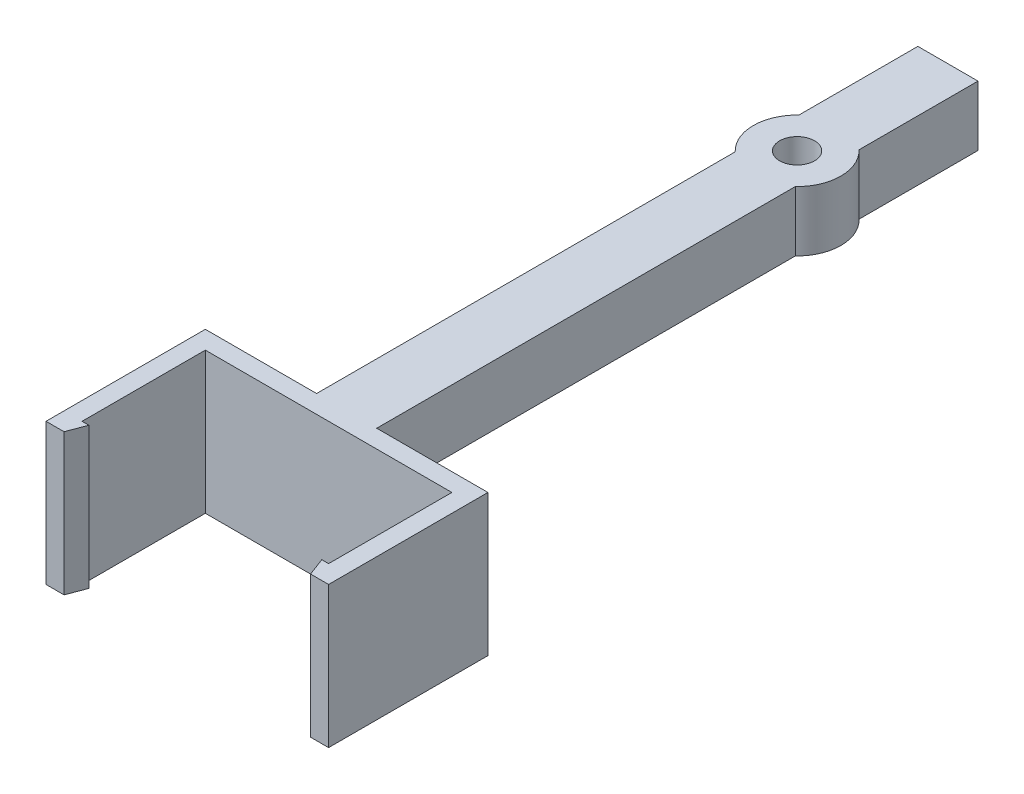
ISO-10303-21;
HEADER;
FILE_DESCRIPTION(('STEP AP214'),'2;1');
FILE_NAME('part.step','',(''),(''),'','','');
FILE_SCHEMA(('AUTOMOTIVE_DESIGN { 1 0 10303 214 1 1 1 1 }'));
ENDSEC;
DATA;
#1=APPLICATION_CONTEXT('core data for automotive mechanical design processes');
#2=APPLICATION_PROTOCOL_DEFINITION('international standard','automotive_design',2000,#1);
#3=PRODUCT_CONTEXT('',#1,'mechanical');
#4=PRODUCT('Part','Part','',(#3));
#5=PRODUCT_RELATED_PRODUCT_CATEGORY('part','',(#4));
#6=PRODUCT_DEFINITION_FORMATION('','',#4);
#7=PRODUCT_DEFINITION_CONTEXT('part definition',#1,'design');
#8=PRODUCT_DEFINITION('design','',#6,#7);
#9=PRODUCT_DEFINITION_SHAPE('','',#8);
#10=(LENGTH_UNIT() NAMED_UNIT(*) SI_UNIT(.MILLI.,.METRE.));
#11=(NAMED_UNIT(*) PLANE_ANGLE_UNIT() SI_UNIT($,.RADIAN.));
#12=(NAMED_UNIT(*) SI_UNIT($,.STERADIAN.) SOLID_ANGLE_UNIT());
#13=UNCERTAINTY_MEASURE_WITH_UNIT(LENGTH_MEASURE(1.E-05),#10,'distance_accuracy_value','');
#14=(GEOMETRIC_REPRESENTATION_CONTEXT(3) GLOBAL_UNCERTAINTY_ASSIGNED_CONTEXT((#13)) GLOBAL_UNIT_ASSIGNED_CONTEXT((#10,
#11,#12)) REPRESENTATION_CONTEXT('',''));
#15=CARTESIAN_POINT('',(0.,0.,0.));
#16=DIRECTION('',(0.,0.,1.));
#17=DIRECTION('',(1.,0.,0.));
#18=AXIS2_PLACEMENT_3D('',#15,#16,#17);
#19=CARTESIAN_POINT('',(-4.99999999999999,31.,-113.25));
#20=DIRECTION('',(1.,0.,0.));
#21=DIRECTION('',(0.,1.,0.));
#22=AXIS2_PLACEMENT_3D('',#19,#20,#21);
#23=PLANE('',#22);
#24=DIRECTION('',(0.,0.,1.));
#25=VECTOR('',#24,1.);
#26=CARTESIAN_POINT('',(-4.99999999999999,31.,-113.25));
#27=LINE('',#26,#25);
#28=CARTESIAN_POINT('',(-4.99999999999999,31.,-82.8689986991754));
#29=VERTEX_POINT('',#28);
#30=CARTESIAN_POINT('',(-4.99999999999999,31.,-13.25));
#31=VERTEX_POINT('',#30);
#32=EDGE_CURVE('E54',#29,#31,#27,.T.);
#33=ORIENTED_EDGE('',*,*,#32,.F.);
#34=DIRECTION('',(0.,-1.,0.));
#35=VECTOR('',#34,1.);
#36=CARTESIAN_POINT('',(-4.99999999999999,31.,-82.8689986991754));
#37=LINE('',#36,#35);
#38=CARTESIAN_POINT('',(-4.99999999999999,21.,-82.8689986991754));
#39=VERTEX_POINT('',#38);
#40=EDGE_CURVE('E281',#29,#39,#37,.T.);
#41=ORIENTED_EDGE('',*,*,#40,.T.);
#42=DIRECTION('',(0.,0.,1.));
#43=VECTOR('',#42,1.);
#44=CARTESIAN_POINT('',(-4.99999999999999,21.,-113.25));
#45=LINE('',#44,#43);
#46=CARTESIAN_POINT('',(-4.99999999999999,21.,-13.25));
#47=VERTEX_POINT('',#46);
#48=EDGE_CURVE('E257',#39,#47,#45,.T.);
#49=ORIENTED_EDGE('',*,*,#48,.T.);
#50=DIRECTION('',(0.,1.,0.));
#51=VECTOR('',#50,1.);
#52=CARTESIAN_POINT('',(-4.99999999999999,31.,-13.25));
#53=LINE('',#52,#51);
#54=EDGE_CURVE('E265',#47,#31,#53,.T.);
#55=ORIENTED_EDGE('',*,*,#54,.T.);
#56=EDGE_LOOP('',(#33,#41,#49,#55));
#57=FACE_BOUND('',#56,.T.);
#58=ADVANCED_FACE('F32',(#57),#23,.F.);
#59=CARTESIAN_POINT('',(5.00000000000001,31.,-113.25));
#60=DIRECTION('',(-1.,0.,0.));
#61=DIRECTION('',(0.,-1.,0.));
#62=AXIS2_PLACEMENT_3D('',#59,#60,#61);
#63=PLANE('',#62);
#64=DIRECTION('',(0.,0.,1.));
#65=VECTOR('',#64,1.);
#66=CARTESIAN_POINT('',(5.00000000000001,31.,-113.25));
#67=LINE('',#66,#65);
#68=CARTESIAN_POINT('',(5.00000000000001,31.,-113.25));
#69=VERTEX_POINT('',#68);
#70=CARTESIAN_POINT('',(5.00000000000001,31.,-93.464207172215));
#71=VERTEX_POINT('',#70);
#72=EDGE_CURVE('E247',#69,#71,#67,.T.);
#73=ORIENTED_EDGE('',*,*,#72,.T.);
#74=DIRECTION('',(0.,-1.,0.));
#75=VECTOR('',#74,1.);
#76=CARTESIAN_POINT('',(5.00000000000001,31.,-93.464207172215));
#77=LINE('',#76,#75);
#78=CARTESIAN_POINT('',(5.00000000000001,21.,-93.464207172215));
#79=VERTEX_POINT('',#78);
#80=EDGE_CURVE('E285',#71,#79,#77,.T.);
#81=ORIENTED_EDGE('',*,*,#80,.T.);
#82=DIRECTION('',(0.,0.,1.));
#83=VECTOR('',#82,1.);
#84=CARTESIAN_POINT('',(5.00000000000001,21.,-113.25));
#85=LINE('',#84,#83);
#86=CARTESIAN_POINT('',(5.00000000000001,21.,-113.25));
#87=VERTEX_POINT('',#86);
#88=EDGE_CURVE('E251',#87,#79,#85,.T.);
#89=ORIENTED_EDGE('',*,*,#88,.F.);
#90=DIRECTION('',(0.,-1.,0.));
#91=VECTOR('',#90,1.);
#92=CARTESIAN_POINT('',(5.00000000000001,31.,-113.25));
#93=LINE('',#92,#91);
#94=EDGE_CURVE('E270',#69,#87,#93,.T.);
#95=ORIENTED_EDGE('',*,*,#94,.F.);
#96=EDGE_LOOP('',(#73,#81,#89,#95));
#97=FACE_BOUND('',#96,.T.);
#98=ADVANCED_FACE('F385',(#97),#63,.F.);
#99=CARTESIAN_POINT('',(-23.5,31.,-13.25));
#100=DIRECTION('',(0.,0.,1.));
#101=DIRECTION('',(1.,0.,0.));
#102=AXIS2_PLACEMENT_3D('',#99,#100,#101);
#103=PLANE('',#102);
#104=DIRECTION('',(0.,-1.,0.));
#105=VECTOR('',#104,1.);
#106=CARTESIAN_POINT('',(23.5,31.,-13.25));
#107=LINE('',#106,#105);
#108=CARTESIAN_POINT('',(23.5,31.,-13.25));
#109=VERTEX_POINT('',#108);
#110=CARTESIAN_POINT('',(23.5,7.49614573750932,-13.25));
#111=VERTEX_POINT('',#110);
#112=EDGE_CURVE('E192',#109,#111,#107,.T.);
#113=ORIENTED_EDGE('',*,*,#112,.T.);
#114=DIRECTION('',(-1.,0.,0.));
#115=VECTOR('',#114,1.);
#116=CARTESIAN_POINT('',(81.5,7.49614573750932,-13.25));
#117=LINE('',#116,#115);
#118=CARTESIAN_POINT('',(-23.5,7.49614573750932,-13.25));
#119=VERTEX_POINT('',#118);
#120=EDGE_CURVE('E311',#111,#119,#117,.T.);
#121=ORIENTED_EDGE('',*,*,#120,.T.);
#122=DIRECTION('',(0.,-1.,0.));
#123=VECTOR('',#122,1.);
#124=CARTESIAN_POINT('',(-23.5,31.,-13.25));
#125=LINE('',#124,#123);
#126=CARTESIAN_POINT('',(-23.5,31.,-13.25));
#127=VERTEX_POINT('',#126);
#128=EDGE_CURVE('E40',#127,#119,#125,.T.);
#129=ORIENTED_EDGE('',*,*,#128,.F.);
#130=DIRECTION('',(-1.,0.,0.));
#131=VECTOR('',#130,1.);
#132=CARTESIAN_POINT('',(-23.5,31.,-13.25));
#133=LINE('',#132,#131);
#134=EDGE_CURVE('E206',#31,#127,#133,.T.);
#135=ORIENTED_EDGE('',*,*,#134,.F.);
#136=ORIENTED_EDGE('',*,*,#54,.F.);
#137=DIRECTION('',(-1.,0.,0.));
#138=VECTOR('',#137,1.);
#139=CARTESIAN_POINT('',(5.00000000000001,21.,-13.25));
#140=LINE('',#139,#138);
#141=CARTESIAN_POINT('',(5.00000000000001,21.,-13.25));
#142=VERTEX_POINT('',#141);
#143=EDGE_CURVE('E258',#142,#47,#140,.T.);
#144=ORIENTED_EDGE('',*,*,#143,.F.);
#145=DIRECTION('',(0.,-1.,0.));
#146=VECTOR('',#145,1.);
#147=CARTESIAN_POINT('',(5.00000000000001,31.,-13.25));
#148=LINE('',#147,#146);
#149=CARTESIAN_POINT('',(5.00000000000001,31.,-13.25));
#150=VERTEX_POINT('',#149);
#151=EDGE_CURVE('E262',#150,#142,#148,.T.);
#152=ORIENTED_EDGE('',*,*,#151,.F.);
#153=EDGE_CURVE('E203',#109,#150,#133,.T.);
#154=ORIENTED_EDGE('',*,*,#153,.F.);
#155=EDGE_LOOP('',(#113,#121,#129,#135,#136,#144,#152,#154));
#156=FACE_BOUND('',#155,.T.);
#157=ADVANCED_FACE('F34',(#156),#103,.F.);
#158=CARTESIAN_POINT('',(0.,31.,0.));
#159=DIRECTION('',(0.,-1.,0.));
#160=DIRECTION('',(0.,0.,-1.));
#161=AXIS2_PLACEMENT_3D('',#158,#159,#160);
#162=PLANE('',#161);
#163=CARTESIAN_POINT('',(-4.99999999999999,31.,-113.25));
#164=VERTEX_POINT('',#163);
#165=CARTESIAN_POINT('',(-4.99999999999999,31.,-93.464207172215));
#166=VERTEX_POINT('',#165);
#167=EDGE_CURVE('E244',#164,#166,#27,.T.);
#168=ORIENTED_EDGE('',*,*,#167,.T.);
#169=CARTESIAN_POINT('',(0.,31.,-88.1666029356952));
#170=DIRECTION('',(0.,-1.,0.));
#171=DIRECTION('',(0.,0.,-1.));
#172=AXIS2_PLACEMENT_3D('',#169,#170,#171);
#173=CIRCLE('',#172,7.28454601514687);
#174=EDGE_CURVE('E294',#29,#166,#173,.T.);
#175=ORIENTED_EDGE('',*,*,#174,.F.);
#176=ORIENTED_EDGE('',*,*,#32,.T.);
#177=ORIENTED_EDGE('',*,*,#134,.T.);
#178=DIRECTION('',(0.,0.,1.));
#179=VECTOR('',#178,1.);
#180=CARTESIAN_POINT('',(-23.5,31.,-13.25));
#181=LINE('',#180,#179);
#182=CARTESIAN_POINT('',(-23.5,31.,13.25));
#183=VERTEX_POINT('',#182);
#184=EDGE_CURVE('E201',#127,#183,#181,.T.);
#185=ORIENTED_EDGE('',*,*,#184,.T.);
#186=DIRECTION('',(1.,0.,0.));
#187=VECTOR('',#186,1.);
#188=CARTESIAN_POINT('',(-23.5,31.,13.25));
#189=LINE('',#188,#187);
#190=CARTESIAN_POINT('',(-20.5,31.,13.25));
#191=VERTEX_POINT('',#190);
#192=EDGE_CURVE('E188',#183,#191,#189,.T.);
#193=ORIENTED_EDGE('',*,*,#192,.T.);
#194=DIRECTION('',(0.353543073980112,0.,-0.935418245941725));
#195=VECTOR('',#194,1.);
#196=CARTESIAN_POINT('',(-13.5557335360472,31.,-5.12341482024928));
#197=LINE('',#196,#195);
#198=CARTESIAN_POINT('',(-19.3661443941875,31.,10.25));
#199=VERTEX_POINT('',#198);
#200=EDGE_CURVE('E234',#191,#199,#197,.T.);
#201=ORIENTED_EDGE('',*,*,#200,.T.);
#202=DIRECTION('',(1.,0.,0.));
#203=VECTOR('',#202,1.);
#204=CARTESIAN_POINT('',(-20.5,31.,10.25));
#205=LINE('',#204,#203);
#206=CARTESIAN_POINT('',(-20.5,31.,10.25));
#207=VERTEX_POINT('',#206);
#208=EDGE_CURVE('E219',#207,#199,#205,.T.);
#209=ORIENTED_EDGE('',*,*,#208,.F.);
#210=DIRECTION('',(0.,0.,1.));
#211=VECTOR('',#210,1.);
#212=CARTESIAN_POINT('',(-20.5,31.,-10.25));
#213=LINE('',#212,#211);
#214=CARTESIAN_POINT('',(-20.5,31.,-10.25));
#215=VERTEX_POINT('',#214);
#216=EDGE_CURVE('E223',#215,#207,#213,.T.);
#217=ORIENTED_EDGE('',*,*,#216,.F.);
#218=DIRECTION('',(-1.,0.,0.));
#219=VECTOR('',#218,1.);
#220=CARTESIAN_POINT('',(-20.5,31.,-10.25));
#221=LINE('',#220,#219);
#222=CARTESIAN_POINT('',(20.5,31.,-10.25));
#223=VERTEX_POINT('',#222);
#224=EDGE_CURVE('E226',#223,#215,#221,.T.);
#225=ORIENTED_EDGE('',*,*,#224,.F.);
#226=DIRECTION('',(0.,0.,-1.));
#227=VECTOR('',#226,1.);
#228=CARTESIAN_POINT('',(20.5,31.,-10.25));
#229=LINE('',#228,#227);
#230=CARTESIAN_POINT('',(20.5,31.,10.25));
#231=VERTEX_POINT('',#230);
#232=EDGE_CURVE('E228',#231,#223,#229,.T.);
#233=ORIENTED_EDGE('',*,*,#232,.F.);
#234=CARTESIAN_POINT('',(19.3661443941875,31.,10.25));
#235=VERTEX_POINT('',#234);
#236=EDGE_CURVE('E222',#235,#231,#205,.T.);
#237=ORIENTED_EDGE('',*,*,#236,.F.);
#238=DIRECTION('',(-0.353543073980112,0.,-0.935418245941725));
#239=VECTOR('',#238,1.);
#240=CARTESIAN_POINT('',(13.5557335360472,31.,-5.12341482024927));
#241=LINE('',#240,#239);
#242=CARTESIAN_POINT('',(20.5,31.,13.25));
#243=VERTEX_POINT('',#242);
#244=EDGE_CURVE('E241',#243,#235,#241,.T.);
#245=ORIENTED_EDGE('',*,*,#244,.F.);
#246=CARTESIAN_POINT('',(23.5,31.,13.25));
#247=VERTEX_POINT('',#246);
#248=EDGE_CURVE('E200',#243,#247,#189,.T.);
#249=ORIENTED_EDGE('',*,*,#248,.T.);
#250=DIRECTION('',(0.,0.,-1.));
#251=VECTOR('',#250,1.);
#252=CARTESIAN_POINT('',(23.5,31.,-13.25));
#253=LINE('',#252,#251);
#254=EDGE_CURVE('E197',#247,#109,#253,.T.);
#255=ORIENTED_EDGE('',*,*,#254,.T.);
#256=ORIENTED_EDGE('',*,*,#153,.T.);
#257=CARTESIAN_POINT('',(5.00000000000001,31.,-82.8689986991755));
#258=VERTEX_POINT('',#257);
#259=EDGE_CURVE('E250',#258,#150,#67,.T.);
#260=ORIENTED_EDGE('',*,*,#259,.F.);
#261=EDGE_CURVE('E291',#71,#258,#173,.T.);
#262=ORIENTED_EDGE('',*,*,#261,.F.);
#263=ORIENTED_EDGE('',*,*,#72,.F.);
#264=DIRECTION('',(1.,0.,0.));
#265=VECTOR('',#264,1.);
#266=CARTESIAN_POINT('',(5.00000000000001,31.,-113.25));
#267=LINE('',#266,#265);
#268=EDGE_CURVE('E272',#164,#69,#267,.T.);
#269=ORIENTED_EDGE('',*,*,#268,.F.);
#270=EDGE_LOOP('',(#168,#175,#176,#177,#185,#193,#201,#209,#217,#225,#233,#237,#245,#249,#255,
#256,#260,#262,#263,#269));
#271=FACE_BOUND('',#270,.T.);
#272=CARTESIAN_POINT('',(0.,31.,-88.1666029356952));
#273=DIRECTION('',(0.,-1.,0.));
#274=DIRECTION('',(0.,0.,-1.));
#275=AXIS2_PLACEMENT_3D('',#272,#273,#274);
#276=CIRCLE('',#275,2.9);
#277=CARTESIAN_POINT('',(0.,31.,-91.0666029356952));
#278=VERTEX_POINT('',#277);
#279=EDGE_CURVE('E267',#278,#278,#276,.T.);
#280=ORIENTED_EDGE('',*,*,#279,.T.);
#281=EDGE_LOOP('',(#280));
#282=FACE_BOUND('',#281,.T.);
#283=ADVANCED_FACE('F327',(#271,#282),#162,.F.);
#284=CARTESIAN_POINT('',(-23.5,31.,13.25));
#285=DIRECTION('',(0.,0.,-1.));
#286=DIRECTION('',(-1.,0.,0.));
#287=AXIS2_PLACEMENT_3D('',#284,#285,#286);
#288=PLANE('',#287);
#289=DIRECTION('',(0.,-1.,0.));
#290=VECTOR('',#289,1.);
#291=CARTESIAN_POINT('',(-23.5,31.,13.25));
#292=LINE('',#291,#290);
#293=CARTESIAN_POINT('',(-23.5,7.49614573750932,13.25));
#294=VERTEX_POINT('',#293);
#295=EDGE_CURVE('E182',#183,#294,#292,.T.);
#296=ORIENTED_EDGE('',*,*,#295,.T.);
#297=DIRECTION('',(-1.,0.,0.));
#298=VECTOR('',#297,1.);
#299=CARTESIAN_POINT('',(81.5,7.49614573750932,13.25));
#300=LINE('',#299,#298);
#301=CARTESIAN_POINT('',(-20.5,7.49614573750932,13.25));
#302=VERTEX_POINT('',#301);
#303=EDGE_CURVE('E167',#302,#294,#300,.T.);
#304=ORIENTED_EDGE('',*,*,#303,.F.);
#305=DIRECTION('',(0.,1.,0.));
#306=VECTOR('',#305,1.);
#307=CARTESIAN_POINT('',(-20.5,0.,13.25));
#308=LINE('',#307,#306);
#309=EDGE_CURVE('E230',#302,#191,#308,.T.);
#310=ORIENTED_EDGE('',*,*,#309,.T.);
#311=ORIENTED_EDGE('',*,*,#192,.F.);
#312=EDGE_LOOP('',(#296,#304,#310,#311));
#313=FACE_BOUND('',#312,.T.);
#314=ADVANCED_FACE('F186',(#313),#288,.F.);
#315=CARTESIAN_POINT('',(-20.5,31.,10.25));
#316=DIRECTION('',(0.,0.,-1.));
#317=DIRECTION('',(-1.,0.,0.));
#318=AXIS2_PLACEMENT_3D('',#315,#316,#317);
#319=PLANE('',#318);
#320=DIRECTION('',(1.,0.,0.));
#321=VECTOR('',#320,1.);
#322=CARTESIAN_POINT('',(-20.5,7.49614573750932,10.25));
#323=LINE('',#322,#321);
#324=CARTESIAN_POINT('',(-20.5,7.49614573750932,10.25));
#325=VERTEX_POINT('',#324);
#326=CARTESIAN_POINT('',(-19.3661443941875,7.49614573750932,10.25));
#327=VERTEX_POINT('',#326);
#328=EDGE_CURVE('E46',#325,#327,#323,.T.);
#329=ORIENTED_EDGE('',*,*,#328,.F.);
#330=DIRECTION('',(0.,-1.,0.));
#331=VECTOR('',#330,1.);
#332=CARTESIAN_POINT('',(-20.5,31.,10.25));
#333=LINE('',#332,#331);
#334=EDGE_CURVE('E213',#207,#325,#333,.T.);
#335=ORIENTED_EDGE('',*,*,#334,.F.);
#336=ORIENTED_EDGE('',*,*,#208,.T.);
#337=DIRECTION('',(0.,1.,0.));
#338=VECTOR('',#337,1.);
#339=CARTESIAN_POINT('',(-19.3661443941875,0.,10.25));
#340=LINE('',#339,#338);
#341=EDGE_CURVE('E236',#327,#199,#340,.T.);
#342=ORIENTED_EDGE('',*,*,#341,.F.);
#343=EDGE_LOOP('',(#329,#335,#336,#342));
#344=FACE_BOUND('',#343,.T.);
#345=ADVANCED_FACE('F352',(#344),#319,.T.);
#346=CARTESIAN_POINT('',(-23.5,31.,-13.25));
#347=DIRECTION('',(1.,0.,0.));
#348=DIRECTION('',(0.,0.,-1.));
#349=AXIS2_PLACEMENT_3D('',#346,#347,#348);
#350=PLANE('',#349);
#351=ORIENTED_EDGE('',*,*,#128,.T.);
#352=DIRECTION('',(0.,0.,-1.));
#353=VECTOR('',#352,1.);
#354=CARTESIAN_POINT('',(-23.5,7.49614573750932,-13.25));
#355=LINE('',#354,#353);
#356=EDGE_CURVE('E170',#294,#119,#355,.T.);
#357=ORIENTED_EDGE('',*,*,#356,.F.);
#358=ORIENTED_EDGE('',*,*,#295,.F.);
#359=ORIENTED_EDGE('',*,*,#184,.F.);
#360=EDGE_LOOP('',(#351,#357,#358,#359));
#361=FACE_BOUND('',#360,.T.);
#362=ADVANCED_FACE('F180',(#361),#350,.F.);
#363=DIRECTION('',(0.,1.,0.));
#364=VECTOR('',#363,1.);
#365=CARTESIAN_POINT('',(20.5,0.,13.25));
#366=LINE('',#365,#364);
#367=CARTESIAN_POINT('',(20.5,7.49614573750932,13.25));
#368=VERTEX_POINT('',#367);
#369=EDGE_CURVE('E231',#368,#243,#366,.T.);
#370=ORIENTED_EDGE('',*,*,#369,.F.);
#371=CARTESIAN_POINT('',(23.5,7.49614573750932,13.25));
#372=VERTEX_POINT('',#371);
#373=EDGE_CURVE('E175',#372,#368,#300,.T.);
#374=ORIENTED_EDGE('',*,*,#373,.F.);
#375=DIRECTION('',(0.,-1.,0.));
#376=VECTOR('',#375,1.);
#377=CARTESIAN_POINT('',(23.5,31.,13.25));
#378=LINE('',#377,#376);
#379=EDGE_CURVE('E189',#247,#372,#378,.T.);
#380=ORIENTED_EDGE('',*,*,#379,.F.);
#381=ORIENTED_EDGE('',*,*,#248,.F.);
#382=EDGE_LOOP('',(#370,#374,#380,#381));
#383=FACE_BOUND('',#382,.T.);
#384=ADVANCED_FACE('F324',(#383),#288,.F.);
#385=CARTESIAN_POINT('',(23.5,31.,-13.25));
#386=DIRECTION('',(-1.,0.,0.));
#387=DIRECTION('',(0.,0.,1.));
#388=AXIS2_PLACEMENT_3D('',#385,#386,#387);
#389=PLANE('',#388);
#390=ORIENTED_EDGE('',*,*,#379,.T.);
#391=DIRECTION('',(0.,0.,-1.));
#392=VECTOR('',#391,1.);
#393=CARTESIAN_POINT('',(23.5,7.49614573750932,-13.25));
#394=LINE('',#393,#392);
#395=EDGE_CURVE('E297',#372,#111,#394,.T.);
#396=ORIENTED_EDGE('',*,*,#395,.T.);
#397=ORIENTED_EDGE('',*,*,#112,.F.);
#398=ORIENTED_EDGE('',*,*,#254,.F.);
#399=EDGE_LOOP('',(#390,#396,#397,#398));
#400=FACE_BOUND('',#399,.T.);
#401=ADVANCED_FACE('F374',(#400),#389,.F.);
#402=CARTESIAN_POINT('',(20.5,31.,-10.25));
#403=DIRECTION('',(-1.,0.,0.));
#404=DIRECTION('',(0.,0.,1.));
#405=AXIS2_PLACEMENT_3D('',#402,#403,#404);
#406=PLANE('',#405);
#407=DIRECTION('',(0.,0.,-1.));
#408=VECTOR('',#407,1.);
#409=CARTESIAN_POINT('',(20.5,7.49614573750932,-10.25));
#410=LINE('',#409,#408);
#411=CARTESIAN_POINT('',(20.5,7.49614573750932,10.25));
#412=VERTEX_POINT('',#411);
#413=CARTESIAN_POINT('',(20.5,7.49614573750932,-10.25));
#414=VERTEX_POINT('',#413);
#415=EDGE_CURVE('E305',#412,#414,#410,.T.);
#416=ORIENTED_EDGE('',*,*,#415,.F.);
#417=DIRECTION('',(0.,-1.,0.));
#418=VECTOR('',#417,1.);
#419=CARTESIAN_POINT('',(20.5,31.,10.25));
#420=LINE('',#419,#418);
#421=EDGE_CURVE('E216',#231,#412,#420,.T.);
#422=ORIENTED_EDGE('',*,*,#421,.F.);
#423=ORIENTED_EDGE('',*,*,#232,.T.);
#424=DIRECTION('',(0.,-1.,0.));
#425=VECTOR('',#424,1.);
#426=CARTESIAN_POINT('',(20.5,31.,-10.25));
#427=LINE('',#426,#425);
#428=EDGE_CURVE('E207',#223,#414,#427,.T.);
#429=ORIENTED_EDGE('',*,*,#428,.T.);
#430=EDGE_LOOP('',(#416,#422,#423,#429));
#431=FACE_BOUND('',#430,.T.);
#432=ADVANCED_FACE('F338',(#431),#406,.T.);
#433=CARTESIAN_POINT('',(-20.5,31.,-10.25));
#434=DIRECTION('',(0.,0.,1.));
#435=DIRECTION('',(1.,0.,0.));
#436=AXIS2_PLACEMENT_3D('',#433,#434,#435);
#437=PLANE('',#436);
#438=DIRECTION('',(-1.,0.,0.));
#439=VECTOR('',#438,1.);
#440=CARTESIAN_POINT('',(-20.5,7.49614573750932,-10.25));
#441=LINE('',#440,#439);
#442=CARTESIAN_POINT('',(-20.5,7.49614573750932,-10.25));
#443=VERTEX_POINT('',#442);
#444=EDGE_CURVE('E307',#414,#443,#441,.T.);
#445=ORIENTED_EDGE('',*,*,#444,.F.);
#446=ORIENTED_EDGE('',*,*,#428,.F.);
#447=ORIENTED_EDGE('',*,*,#224,.T.);
#448=DIRECTION('',(0.,-1.,0.));
#449=VECTOR('',#448,1.);
#450=CARTESIAN_POINT('',(-20.5,31.,-10.25));
#451=LINE('',#450,#449);
#452=EDGE_CURVE('E210',#215,#443,#451,.T.);
#453=ORIENTED_EDGE('',*,*,#452,.T.);
#454=EDGE_LOOP('',(#445,#446,#447,#453));
#455=FACE_BOUND('',#454,.T.);
#456=ADVANCED_FACE('F343',(#455),#437,.T.);
#457=CARTESIAN_POINT('',(-20.5,31.,-10.25));
#458=DIRECTION('',(1.,0.,0.));
#459=DIRECTION('',(0.,0.,-1.));
#460=AXIS2_PLACEMENT_3D('',#457,#458,#459);
#461=PLANE('',#460);
#462=DIRECTION('',(0.,0.,1.));
#463=VECTOR('',#462,1.);
#464=CARTESIAN_POINT('',(-20.5,7.49614573750932,-10.25));
#465=LINE('',#464,#463);
#466=EDGE_CURVE('E309',#443,#325,#465,.T.);
#467=ORIENTED_EDGE('',*,*,#466,.F.);
#468=ORIENTED_EDGE('',*,*,#452,.F.);
#469=ORIENTED_EDGE('',*,*,#216,.T.);
#470=ORIENTED_EDGE('',*,*,#334,.T.);
#471=EDGE_LOOP('',(#467,#468,#469,#470));
#472=FACE_BOUND('',#471,.T.);
#473=ADVANCED_FACE('F347',(#472),#461,.T.);
#474=DIRECTION('',(1.,0.,0.));
#475=VECTOR('',#474,1.);
#476=CARTESIAN_POINT('',(-20.5,7.49614573750932,10.25));
#477=LINE('',#476,#475);
#478=CARTESIAN_POINT('',(19.3661443941875,7.49614573750932,10.25));
#479=VERTEX_POINT('',#478);
#480=EDGE_CURVE('E303',#479,#412,#477,.T.);
#481=ORIENTED_EDGE('',*,*,#480,.F.);
#482=DIRECTION('',(0.,1.,0.));
#483=VECTOR('',#482,1.);
#484=CARTESIAN_POINT('',(19.3661443941875,0.,10.25));
#485=LINE('',#484,#483);
#486=EDGE_CURVE('E233',#479,#235,#485,.T.);
#487=ORIENTED_EDGE('',*,*,#486,.T.);
#488=ORIENTED_EDGE('',*,*,#236,.T.);
#489=ORIENTED_EDGE('',*,*,#421,.T.);
#490=EDGE_LOOP('',(#481,#487,#488,#489));
#491=FACE_BOUND('',#490,.T.);
#492=ADVANCED_FACE('F335',(#491),#319,.T.);
#493=CARTESIAN_POINT('',(13.5557335360472,0.,-5.12341482024927));
#494=DIRECTION('',(0.935418245941725,0.,-0.353543073980112));
#495=DIRECTION('',(-0.353543073980112,0.,-0.935418245941725));
#496=AXIS2_PLACEMENT_3D('',#493,#494,#495);
#497=PLANE('',#496);
#498=ORIENTED_EDGE('',*,*,#486,.F.);
#499=DIRECTION('',(0.353543073980112,0.,0.935418245941725));
#500=VECTOR('',#499,1.);
#501=CARTESIAN_POINT('',(13.5557335360472,7.49614573750932,-5.12341482024927));
#502=LINE('',#501,#500);
#503=EDGE_CURVE('E300',#479,#368,#502,.T.);
#504=ORIENTED_EDGE('',*,*,#503,.T.);
#505=ORIENTED_EDGE('',*,*,#369,.T.);
#506=ORIENTED_EDGE('',*,*,#244,.T.);
#507=EDGE_LOOP('',(#498,#504,#505,#506));
#508=FACE_BOUND('',#507,.T.);
#509=ADVANCED_FACE('F321',(#508),#497,.F.);
#510=CARTESIAN_POINT('',(-13.5557335360472,0.,-5.12341482024928));
#511=DIRECTION('',(0.935418245941725,0.,0.353543073980112));
#512=DIRECTION('',(0.353543073980112,0.,-0.935418245941725));
#513=AXIS2_PLACEMENT_3D('',#510,#511,#512);
#514=PLANE('',#513);
#515=DIRECTION('',(-0.353543073980112,0.,0.935418245941725));
#516=VECTOR('',#515,1.);
#517=CARTESIAN_POINT('',(-13.5557335360472,7.49614573750932,-5.12341482024928));
#518=LINE('',#517,#516);
#519=EDGE_CURVE('E11',#327,#302,#518,.T.);
#520=ORIENTED_EDGE('',*,*,#519,.F.);
#521=ORIENTED_EDGE('',*,*,#341,.T.);
#522=ORIENTED_EDGE('',*,*,#200,.F.);
#523=ORIENTED_EDGE('',*,*,#309,.F.);
#524=EDGE_LOOP('',(#520,#521,#522,#523));
#525=FACE_BOUND('',#524,.T.);
#526=ADVANCED_FACE('F354',(#525),#514,.T.);
#527=CARTESIAN_POINT('',(-4.99999999999999,21.,-113.25));
#528=VERTEX_POINT('',#527);
#529=CARTESIAN_POINT('',(-4.99999999999999,21.,-93.464207172215));
#530=VERTEX_POINT('',#529);
#531=EDGE_CURVE('E255',#528,#530,#45,.T.);
#532=ORIENTED_EDGE('',*,*,#531,.T.);
#533=DIRECTION('',(0.,-1.,0.));
#534=VECTOR('',#533,1.);
#535=CARTESIAN_POINT('',(-4.99999999999999,31.,-93.464207172215));
#536=LINE('',#535,#534);
#537=EDGE_CURVE('E283',#530,#166,#536,.F.);
#538=ORIENTED_EDGE('',*,*,#537,.T.);
#539=ORIENTED_EDGE('',*,*,#167,.F.);
#540=DIRECTION('',(0.,1.,0.));
#541=VECTOR('',#540,1.);
#542=CARTESIAN_POINT('',(-4.99999999999999,31.,-113.25));
#543=LINE('',#542,#541);
#544=EDGE_CURVE('E261',#528,#164,#543,.T.);
#545=ORIENTED_EDGE('',*,*,#544,.F.);
#546=EDGE_LOOP('',(#532,#538,#539,#545));
#547=FACE_BOUND('',#546,.T.);
#548=ADVANCED_FACE('F387',(#547),#23,.F.);
#549=CARTESIAN_POINT('',(5.00000000000001,21.,-82.8689986991755));
#550=VERTEX_POINT('',#549);
#551=EDGE_CURVE('E254',#550,#142,#85,.T.);
#552=ORIENTED_EDGE('',*,*,#551,.F.);
#553=DIRECTION('',(0.,-1.,0.));
#554=VECTOR('',#553,1.);
#555=CARTESIAN_POINT('',(5.00000000000001,31.,-82.8689986991755));
#556=LINE('',#555,#554);
#557=EDGE_CURVE('E288',#550,#258,#556,.F.);
#558=ORIENTED_EDGE('',*,*,#557,.T.);
#559=ORIENTED_EDGE('',*,*,#259,.T.);
#560=ORIENTED_EDGE('',*,*,#151,.T.);
#561=EDGE_LOOP('',(#552,#558,#559,#560));
#562=FACE_BOUND('',#561,.T.);
#563=ADVANCED_FACE('F368',(#562),#63,.F.);
#564=CARTESIAN_POINT('',(5.00000000000001,21.,-113.25));
#565=DIRECTION('',(0.,1.,0.));
#566=DIRECTION('',(0.,0.,1.));
#567=AXIS2_PLACEMENT_3D('',#564,#565,#566);
#568=PLANE('',#567);
#569=ORIENTED_EDGE('',*,*,#48,.F.);
#570=CARTESIAN_POINT('',(0.,21.,-88.1666029356952));
#571=DIRECTION('',(0.,-1.,0.));
#572=DIRECTION('',(0.,0.,-1.));
#573=AXIS2_PLACEMENT_3D('',#570,#571,#572);
#574=CIRCLE('',#573,7.28454601514687);
#575=EDGE_CURVE('E295',#39,#530,#574,.T.);
#576=ORIENTED_EDGE('',*,*,#575,.T.);
#577=ORIENTED_EDGE('',*,*,#531,.F.);
#578=DIRECTION('',(-1.,0.,0.));
#579=VECTOR('',#578,1.);
#580=CARTESIAN_POINT('',(5.00000000000001,21.,-113.25));
#581=LINE('',#580,#579);
#582=EDGE_CURVE('E268',#87,#528,#581,.T.);
#583=ORIENTED_EDGE('',*,*,#582,.F.);
#584=ORIENTED_EDGE('',*,*,#88,.T.);
#585=EDGE_CURVE('E292',#79,#550,#574,.T.);
#586=ORIENTED_EDGE('',*,*,#585,.T.);
#587=ORIENTED_EDGE('',*,*,#551,.T.);
#588=ORIENTED_EDGE('',*,*,#143,.T.);
#589=EDGE_LOOP('',(#569,#576,#577,#583,#584,#586,#587,#588));
#590=FACE_BOUND('',#589,.T.);
#591=CARTESIAN_POINT('',(0.,21.,-88.1666029356952));
#592=DIRECTION('',(0.,-1.,0.));
#593=DIRECTION('',(0.,0.,-1.));
#594=AXIS2_PLACEMENT_3D('',#591,#592,#593);
#595=CIRCLE('',#594,2.9);
#596=CARTESIAN_POINT('',(0.,21.,-91.0666029356952));
#597=VERTEX_POINT('',#596);
#598=EDGE_CURVE('E278',#597,#597,#595,.T.);
#599=ORIENTED_EDGE('',*,*,#598,.F.);
#600=EDGE_LOOP('',(#599));
#601=FACE_BOUND('',#600,.T.);
#602=ADVANCED_FACE('F361',(#590,#601),#568,.F.);
#603=CARTESIAN_POINT('',(0.,0.,-113.25));
#604=DIRECTION('',(0.,0.,-1.));
#605=DIRECTION('',(-1.,0.,0.));
#606=AXIS2_PLACEMENT_3D('',#603,#604,#605);
#607=PLANE('',#606);
#608=ORIENTED_EDGE('',*,*,#544,.T.);
#609=ORIENTED_EDGE('',*,*,#268,.T.);
#610=ORIENTED_EDGE('',*,*,#94,.T.);
#611=ORIENTED_EDGE('',*,*,#582,.T.);
#612=EDGE_LOOP('',(#608,#609,#610,#611));
#613=FACE_BOUND('',#612,.T.);
#614=ADVANCED_FACE('F410',(#613),#607,.T.);
#615=CARTESIAN_POINT('',(0.,121.,-88.1666029356952));
#616=DIRECTION('',(0.,-1.,0.));
#617=DIRECTION('',(0.,0.,-1.));
#618=AXIS2_PLACEMENT_3D('',#615,#616,#617);
#619=CYLINDRICAL_SURFACE('',#618,2.9);
#620=ORIENTED_EDGE('',*,*,#598,.T.);
#621=EDGE_LOOP('',(#620));
#622=FACE_BOUND('',#621,.T.);
#623=ORIENTED_EDGE('',*,*,#279,.F.);
#624=EDGE_LOOP('',(#623));
#625=FACE_BOUND('',#624,.T.);
#626=ADVANCED_FACE('F415',(#622,#625),#619,.F.);
#627=CARTESIAN_POINT('',(0.,31.,-88.1666029356952));
#628=DIRECTION('',(0.,-1.,0.));
#629=DIRECTION('',(0.,0.,-1.));
#630=AXIS2_PLACEMENT_3D('',#627,#628,#629);
#631=CYLINDRICAL_SURFACE('',#630,7.28454601514687);
#632=ORIENTED_EDGE('',*,*,#80,.F.);
#633=ORIENTED_EDGE('',*,*,#261,.T.);
#634=ORIENTED_EDGE('',*,*,#557,.F.);
#635=ORIENTED_EDGE('',*,*,#585,.F.);
#636=EDGE_LOOP('',(#632,#633,#634,#635));
#637=FACE_BOUND('',#636,.T.);
#638=ADVANCED_FACE('F413',(#637),#631,.T.);
#639=ORIENTED_EDGE('',*,*,#40,.F.);
#640=ORIENTED_EDGE('',*,*,#174,.T.);
#641=ORIENTED_EDGE('',*,*,#537,.F.);
#642=ORIENTED_EDGE('',*,*,#575,.F.);
#643=EDGE_LOOP('',(#639,#640,#641,#642));
#644=FACE_BOUND('',#643,.T.);
#645=ADVANCED_FACE('F406',(#644),#631,.T.);
#646=CARTESIAN_POINT('',(81.5,7.49614573750932,-13.25));
#647=DIRECTION('',(0.,1.,0.));
#648=DIRECTION('',(0.,0.,1.));
#649=AXIS2_PLACEMENT_3D('',#646,#647,#648);
#650=PLANE('',#649);
#651=ORIENTED_EDGE('',*,*,#373,.T.);
#652=ORIENTED_EDGE('',*,*,#503,.F.);
#653=ORIENTED_EDGE('',*,*,#480,.T.);
#654=ORIENTED_EDGE('',*,*,#415,.T.);
#655=ORIENTED_EDGE('',*,*,#444,.T.);
#656=ORIENTED_EDGE('',*,*,#466,.T.);
#657=ORIENTED_EDGE('',*,*,#328,.T.);
#658=ORIENTED_EDGE('',*,*,#519,.T.);
#659=ORIENTED_EDGE('',*,*,#303,.T.);
#660=ORIENTED_EDGE('',*,*,#356,.T.);
#661=ORIENTED_EDGE('',*,*,#120,.F.);
#662=ORIENTED_EDGE('',*,*,#395,.F.);
#663=EDGE_LOOP('',(#651,#652,#653,#654,#655,#656,#657,#658,#659,#660,#661,#662));
#664=FACE_BOUND('',#663,.T.);
#665=ADVANCED_FACE('F169',(#664),#650,.F.);
#666=CLOSED_SHELL('',(#58,#98,#157,#283,#314,#345,#362,#384,#401,#432,#456,#473,#492,#509,#526,
#548,#563,#602,#614,#626,#638,#645,#665));
#667=MANIFOLD_SOLID_BREP('B2',#666);
#668=ADVANCED_BREP_SHAPE_REPRESENTATION('',(#18,#667),#14);
#669=SHAPE_DEFINITION_REPRESENTATION(#9,#668);
ENDSEC;
END-ISO-10303-21;
